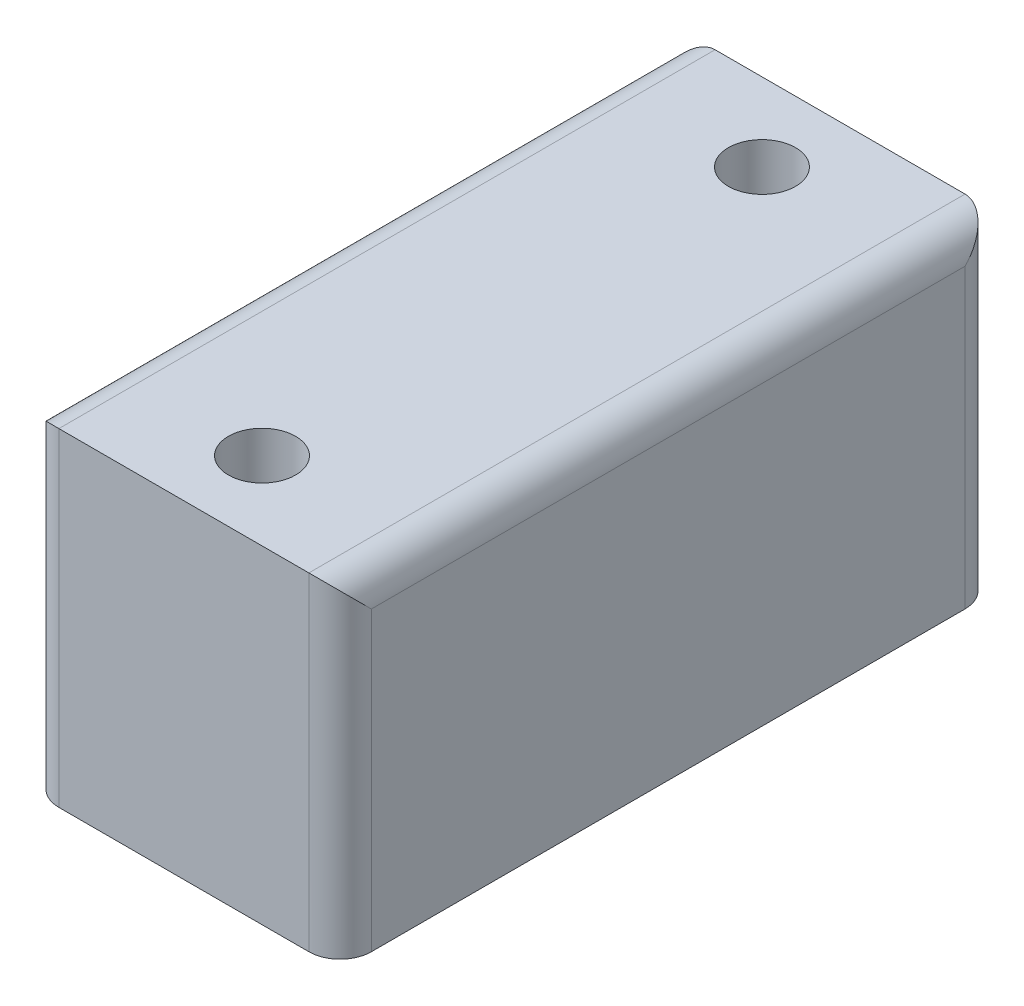
ISO-10303-21;
HEADER;
FILE_DESCRIPTION(('STEP AP214'),'2;1');
FILE_NAME('part.step','',(''),(''),'','','');
FILE_SCHEMA(('AUTOMOTIVE_DESIGN { 1 0 10303 214 1 1 1 1 }'));
ENDSEC;
DATA;
#1=APPLICATION_CONTEXT('core data for automotive mechanical design processes');
#2=APPLICATION_PROTOCOL_DEFINITION('international standard','automotive_design',2000,#1);
#3=PRODUCT_CONTEXT('',#1,'mechanical');
#4=PRODUCT('Part','Part','',(#3));
#5=PRODUCT_RELATED_PRODUCT_CATEGORY('part','',(#4));
#6=PRODUCT_DEFINITION_FORMATION('','',#4);
#7=PRODUCT_DEFINITION_CONTEXT('part definition',#1,'design');
#8=PRODUCT_DEFINITION('design','',#6,#7);
#9=PRODUCT_DEFINITION_SHAPE('','',#8);
#10=(LENGTH_UNIT() NAMED_UNIT(*) SI_UNIT(.MILLI.,.METRE.));
#11=(NAMED_UNIT(*) PLANE_ANGLE_UNIT() SI_UNIT($,.RADIAN.));
#12=(NAMED_UNIT(*) SI_UNIT($,.STERADIAN.) SOLID_ANGLE_UNIT());
#13=UNCERTAINTY_MEASURE_WITH_UNIT(LENGTH_MEASURE(1.E-05),#10,'distance_accuracy_value','');
#14=(GEOMETRIC_REPRESENTATION_CONTEXT(3) GLOBAL_UNCERTAINTY_ASSIGNED_CONTEXT((#13)) GLOBAL_UNIT_ASSIGNED_CONTEXT((#10,
#11,#12)) REPRESENTATION_CONTEXT('',''));
#15=CARTESIAN_POINT('',(0.,0.,0.));
#16=DIRECTION('',(0.,0.,1.));
#17=DIRECTION('',(1.,0.,0.));
#18=AXIS2_PLACEMENT_3D('',#15,#16,#17);
#19=CARTESIAN_POINT('',(0.,0.,42.));
#20=DIRECTION('',(-1.,0.,0.));
#21=DIRECTION('',(0.,0.,1.));
#22=AXIS2_PLACEMENT_3D('',#19,#20,#21);
#23=PLANE('',#22);
#24=DIRECTION('',(0.,0.,-1.));
#25=VECTOR('',#24,1.);
#26=CARTESIAN_POINT('',(0.,0.,42.));
#27=LINE('',#26,#25);
#28=CARTESIAN_POINT('',(0.,0.,40.));
#29=VERTEX_POINT('',#28);
#30=CARTESIAN_POINT('',(0.,0.,2.00000000000002));
#31=VERTEX_POINT('',#30);
#32=EDGE_CURVE('E128',#29,#31,#27,.T.);
#33=ORIENTED_EDGE('',*,*,#32,.T.);
#34=DIRECTION('',(0.,1.,0.));
#35=VECTOR('',#34,1.);
#36=CARTESIAN_POINT('',(0.,0.,2.));
#37=LINE('',#36,#35);
#38=CARTESIAN_POINT('',(0.,19.,2.));
#39=VERTEX_POINT('',#38);
#40=EDGE_CURVE('E150',#31,#39,#37,.T.);
#41=ORIENTED_EDGE('',*,*,#40,.T.);
#42=DIRECTION('',(0.,0.,-1.));
#43=VECTOR('',#42,1.);
#44=CARTESIAN_POINT('',(0.,19.,42.));
#45=LINE('',#44,#43);
#46=CARTESIAN_POINT('',(0.,19.,40.));
#47=VERTEX_POINT('',#46);
#48=EDGE_CURVE('E146',#39,#47,#45,.F.);
#49=ORIENTED_EDGE('',*,*,#48,.T.);
#50=DIRECTION('',(0.,1.,0.));
#51=VECTOR('',#50,1.);
#52=CARTESIAN_POINT('',(0.,0.,40.));
#53=LINE('',#52,#51);
#54=EDGE_CURVE('E148',#47,#29,#53,.F.);
#55=ORIENTED_EDGE('',*,*,#54,.T.);
#56=EDGE_LOOP('',(#33,#41,#49,#55));
#57=FACE_BOUND('',#56,.T.);
#58=ADVANCED_FACE('F41',(#57),#23,.F.);
#59=CARTESIAN_POINT('',(0.,21.,42.));
#60=DIRECTION('',(0.,-1.,0.));
#61=DIRECTION('',(1.,0.,0.));
#62=AXIS2_PLACEMENT_3D('',#59,#60,#61);
#63=PLANE('',#62);
#64=CARTESIAN_POINT('',(-10.,21.,5.));
#65=DIRECTION('',(0.,1.,0.));
#66=DIRECTION('',(-1.,0.,0.));
#67=AXIS2_PLACEMENT_3D('',#64,#65,#66);
#68=CIRCLE('',#67,2.15);
#69=CARTESIAN_POINT('',(-12.15,21.,5.));
#70=VERTEX_POINT('',#69);
#71=EDGE_CURVE('E193',#70,#70,#68,.T.);
#72=ORIENTED_EDGE('',*,*,#71,.F.);
#73=EDGE_LOOP('',(#72));
#74=FACE_BOUND('',#73,.T.);
#75=CARTESIAN_POINT('',(-10.,21.,37.));
#76=DIRECTION('',(0.,1.,0.));
#77=DIRECTION('',(1.,0.,0.));
#78=AXIS2_PLACEMENT_3D('',#75,#76,#77);
#79=CIRCLE('',#78,2.15);
#80=CARTESIAN_POINT('',(-7.85,21.,37.));
#81=VERTEX_POINT('',#80);
#82=EDGE_CURVE('E190',#81,#81,#79,.T.);
#83=ORIENTED_EDGE('',*,*,#82,.F.);
#84=EDGE_LOOP('',(#83));
#85=FACE_BOUND('',#84,.T.);
#86=DIRECTION('',(-1.,0.,0.));
#87=VECTOR('',#86,1.);
#88=CARTESIAN_POINT('',(0.,21.,42.));
#89=LINE('',#88,#87);
#90=CARTESIAN_POINT('',(-2.,21.,42.));
#91=VERTEX_POINT('',#90);
#92=CARTESIAN_POINT('',(-18.,21.,42.));
#93=VERTEX_POINT('',#92);
#94=EDGE_CURVE('E181',#91,#93,#89,.T.);
#95=ORIENTED_EDGE('',*,*,#94,.F.);
#96=DIRECTION('',(0.,0.,-1.));
#97=VECTOR('',#96,1.);
#98=CARTESIAN_POINT('',(-2.,21.,42.));
#99=LINE('',#98,#97);
#100=CARTESIAN_POINT('',(-2.,21.,0.));
#101=VERTEX_POINT('',#100);
#102=EDGE_CURVE('E11',#91,#101,#99,.T.);
#103=ORIENTED_EDGE('',*,*,#102,.T.);
#104=DIRECTION('',(-1.,0.,0.));
#105=VECTOR('',#104,1.);
#106=CARTESIAN_POINT('',(0.,21.,0.));
#107=LINE('',#106,#105);
#108=CARTESIAN_POINT('',(-18.,21.,0.));
#109=VERTEX_POINT('',#108);
#110=EDGE_CURVE('E186',#101,#109,#107,.T.);
#111=ORIENTED_EDGE('',*,*,#110,.T.);
#112=DIRECTION('',(0.,0.,-1.));
#113=VECTOR('',#112,1.);
#114=CARTESIAN_POINT('',(-18.,21.,42.));
#115=LINE('',#114,#113);
#116=EDGE_CURVE('E50',#109,#93,#115,.F.);
#117=ORIENTED_EDGE('',*,*,#116,.T.);
#118=EDGE_LOOP('',(#95,#103,#111,#117));
#119=FACE_BOUND('',#118,.T.);
#120=ADVANCED_FACE('F204',(#74,#85,#119),#63,.F.);
#121=CARTESIAN_POINT('',(-20.,0.,42.));
#122=DIRECTION('',(1.,0.,0.));
#123=DIRECTION('',(0.,1.,0.));
#124=AXIS2_PLACEMENT_3D('',#121,#122,#123);
#125=PLANE('',#124);
#126=DIRECTION('',(0.,0.,-1.));
#127=VECTOR('',#126,1.);
#128=CARTESIAN_POINT('',(-20.,19.,42.));
#129=LINE('',#128,#127);
#130=CARTESIAN_POINT('',(-20.,19.,40.));
#131=VERTEX_POINT('',#130);
#132=CARTESIAN_POINT('',(-20.,19.,2.));
#133=VERTEX_POINT('',#132);
#134=EDGE_CURVE('E127',#131,#133,#129,.T.);
#135=ORIENTED_EDGE('',*,*,#134,.T.);
#136=DIRECTION('',(0.,-1.,0.));
#137=VECTOR('',#136,1.);
#138=CARTESIAN_POINT('',(-20.,0.,2.));
#139=LINE('',#138,#137);
#140=CARTESIAN_POINT('',(-20.,0.,2.00000000000002));
#141=VERTEX_POINT('',#140);
#142=EDGE_CURVE('E126',#133,#141,#139,.T.);
#143=ORIENTED_EDGE('',*,*,#142,.T.);
#144=DIRECTION('',(0.,0.,-1.));
#145=VECTOR('',#144,1.);
#146=CARTESIAN_POINT('',(-20.,0.,42.));
#147=LINE('',#146,#145);
#148=CARTESIAN_POINT('',(-20.,0.,40.));
#149=VERTEX_POINT('',#148);
#150=EDGE_CURVE('E112',#149,#141,#147,.T.);
#151=ORIENTED_EDGE('',*,*,#150,.F.);
#152=DIRECTION('',(0.,-1.,0.));
#153=VECTOR('',#152,1.);
#154=CARTESIAN_POINT('',(-20.,21.,40.));
#155=LINE('',#154,#153);
#156=EDGE_CURVE('E123',#149,#131,#155,.F.);
#157=ORIENTED_EDGE('',*,*,#156,.T.);
#158=EDGE_LOOP('',(#135,#143,#151,#157));
#159=FACE_BOUND('',#158,.T.);
#160=ADVANCED_FACE('F122',(#159),#125,.F.);
#161=CARTESIAN_POINT('',(0.,0.,42.));
#162=DIRECTION('',(0.,1.,0.));
#163=DIRECTION('',(-1.,0.,0.));
#164=AXIS2_PLACEMENT_3D('',#161,#162,#163);
#165=PLANE('',#164);
#166=CARTESIAN_POINT('',(-9.99999999999999,0.,5.));
#167=DIRECTION('',(0.,1.,0.));
#168=DIRECTION('',(-1.,0.,0.));
#169=AXIS2_PLACEMENT_3D('',#166,#167,#168);
#170=CIRCLE('',#169,2.15);
#171=CARTESIAN_POINT('',(-12.15,0.,5.));
#172=VERTEX_POINT('',#171);
#173=EDGE_CURVE('E187',#172,#172,#170,.F.);
#174=ORIENTED_EDGE('',*,*,#173,.F.);
#175=EDGE_LOOP('',(#174));
#176=FACE_BOUND('',#175,.T.);
#177=CARTESIAN_POINT('',(-9.99999999999999,0.,37.));
#178=DIRECTION('',(0.,1.,0.));
#179=DIRECTION('',(-1.,0.,0.));
#180=AXIS2_PLACEMENT_3D('',#177,#178,#179);
#181=CIRCLE('',#180,2.15);
#182=CARTESIAN_POINT('',(-12.15,0.,37.));
#183=VERTEX_POINT('',#182);
#184=EDGE_CURVE('E160',#183,#183,#181,.F.);
#185=ORIENTED_EDGE('',*,*,#184,.F.);
#186=EDGE_LOOP('',(#185));
#187=FACE_BOUND('',#186,.T.);
#188=ORIENTED_EDGE('',*,*,#150,.T.);
#189=CARTESIAN_POINT('',(-18.,0.,2.));
#190=DIRECTION('',(0.,1.,0.));
#191=DIRECTION('',(-1.,0.,0.));
#192=AXIS2_PLACEMENT_3D('',#189,#190,#191);
#193=CIRCLE('',#192,2.);
#194=CARTESIAN_POINT('',(-18.,0.,0.));
#195=VERTEX_POINT('',#194);
#196=EDGE_CURVE('E140',#141,#195,#193,.F.);
#197=ORIENTED_EDGE('',*,*,#196,.T.);
#198=DIRECTION('',(1.,0.,0.));
#199=VECTOR('',#198,1.);
#200=CARTESIAN_POINT('',(0.,0.,0.));
#201=LINE('',#200,#199);
#202=CARTESIAN_POINT('',(-2.,0.,0.));
#203=VERTEX_POINT('',#202);
#204=EDGE_CURVE('E184',#195,#203,#201,.T.);
#205=ORIENTED_EDGE('',*,*,#204,.T.);
#206=CARTESIAN_POINT('',(-2.,0.,2.));
#207=DIRECTION('',(0.,1.,0.));
#208=DIRECTION('',(-1.,0.,0.));
#209=AXIS2_PLACEMENT_3D('',#206,#207,#208);
#210=CIRCLE('',#209,2.);
#211=EDGE_CURVE('E117',#203,#31,#210,.F.);
#212=ORIENTED_EDGE('',*,*,#211,.T.);
#213=ORIENTED_EDGE('',*,*,#32,.F.);
#214=CARTESIAN_POINT('',(-2.,0.,40.));
#215=DIRECTION('',(0.,1.,0.));
#216=DIRECTION('',(-1.,0.,0.));
#217=AXIS2_PLACEMENT_3D('',#214,#215,#216);
#218=CIRCLE('',#217,2.);
#219=CARTESIAN_POINT('',(-2.,0.,42.));
#220=VERTEX_POINT('',#219);
#221=EDGE_CURVE('E118',#29,#220,#218,.F.);
#222=ORIENTED_EDGE('',*,*,#221,.T.);
#223=DIRECTION('',(1.,0.,0.));
#224=VECTOR('',#223,1.);
#225=CARTESIAN_POINT('',(0.,0.,42.));
#226=LINE('',#225,#224);
#227=CARTESIAN_POINT('',(-18.,0.,42.));
#228=VERTEX_POINT('',#227);
#229=EDGE_CURVE('E113',#228,#220,#226,.T.);
#230=ORIENTED_EDGE('',*,*,#229,.F.);
#231=CARTESIAN_POINT('',(-18.,0.,40.));
#232=DIRECTION('',(0.,1.,0.));
#233=DIRECTION('',(-1.,0.,0.));
#234=AXIS2_PLACEMENT_3D('',#231,#232,#233);
#235=CIRCLE('',#234,2.);
#236=EDGE_CURVE('E109',#228,#149,#235,.F.);
#237=ORIENTED_EDGE('',*,*,#236,.T.);
#238=EDGE_LOOP('',(#188,#197,#205,#212,#213,#222,#230,#237));
#239=FACE_BOUND('',#238,.T.);
#240=ADVANCED_FACE('F111',(#176,#187,#239),#165,.F.);
#241=CARTESIAN_POINT('',(0.,0.,42.));
#242=DIRECTION('',(0.,0.,1.));
#243=DIRECTION('',(1.,0.,0.));
#244=AXIS2_PLACEMENT_3D('',#241,#242,#243);
#245=PLANE('',#244);
#246=ORIENTED_EDGE('',*,*,#94,.T.);
#247=DIRECTION('',(0.,-1.,0.));
#248=VECTOR('',#247,1.);
#249=CARTESIAN_POINT('',(-18.,0.,42.));
#250=LINE('',#249,#248);
#251=EDGE_CURVE('E154',#93,#228,#250,.T.);
#252=ORIENTED_EDGE('',*,*,#251,.T.);
#253=ORIENTED_EDGE('',*,*,#229,.T.);
#254=DIRECTION('',(0.,1.,0.));
#255=VECTOR('',#254,1.);
#256=CARTESIAN_POINT('',(-2.,21.,42.));
#257=LINE('',#256,#255);
#258=EDGE_CURVE('E64',#220,#91,#257,.T.);
#259=ORIENTED_EDGE('',*,*,#258,.T.);
#260=EDGE_LOOP('',(#246,#252,#253,#259));
#261=FACE_BOUND('',#260,.T.);
#262=ADVANCED_FACE('F210',(#261),#245,.T.);
#263=CARTESIAN_POINT('',(0.,0.,0.));
#264=DIRECTION('',(0.,0.,1.));
#265=DIRECTION('',(1.,0.,0.));
#266=AXIS2_PLACEMENT_3D('',#263,#264,#265);
#267=PLANE('',#266);
#268=ORIENTED_EDGE('',*,*,#204,.F.);
#269=DIRECTION('',(0.,-1.,0.));
#270=VECTOR('',#269,1.);
#271=CARTESIAN_POINT('',(-18.,0.,0.));
#272=LINE('',#271,#270);
#273=EDGE_CURVE('E144',#195,#109,#272,.F.);
#274=ORIENTED_EDGE('',*,*,#273,.T.);
#275=ORIENTED_EDGE('',*,*,#110,.F.);
#276=DIRECTION('',(0.,1.,0.));
#277=VECTOR('',#276,1.);
#278=CARTESIAN_POINT('',(-2.,0.,0.));
#279=LINE('',#278,#277);
#280=EDGE_CURVE('E142',#101,#203,#279,.F.);
#281=ORIENTED_EDGE('',*,*,#280,.T.);
#282=EDGE_LOOP('',(#268,#274,#275,#281));
#283=FACE_BOUND('',#282,.T.);
#284=ADVANCED_FACE('F219',(#283),#267,.F.);
#285=CARTESIAN_POINT('',(-9.99999999999999,-0.00100000000000447,37.));
#286=DIRECTION('',(0.,1.,0.));
#287=DIRECTION('',(-1.,0.,0.));
#288=AXIS2_PLACEMENT_3D('',#285,#286,#287);
#289=CYLINDRICAL_SURFACE('',#288,2.15);
#290=ORIENTED_EDGE('',*,*,#82,.T.);
#291=EDGE_LOOP('',(#290));
#292=FACE_BOUND('',#291,.T.);
#293=ORIENTED_EDGE('',*,*,#184,.T.);
#294=EDGE_LOOP('',(#293));
#295=FACE_BOUND('',#294,.T.);
#296=ADVANCED_FACE('F241',(#292,#295),#289,.F.);
#297=CARTESIAN_POINT('',(-9.99999999999999,-0.00100000000000447,5.));
#298=DIRECTION('',(0.,1.,0.));
#299=DIRECTION('',(-1.,0.,0.));
#300=AXIS2_PLACEMENT_3D('',#297,#298,#299);
#301=CYLINDRICAL_SURFACE('',#300,2.15);
#302=ORIENTED_EDGE('',*,*,#71,.T.);
#303=EDGE_LOOP('',(#302));
#304=FACE_BOUND('',#303,.T.);
#305=ORIENTED_EDGE('',*,*,#173,.T.);
#306=EDGE_LOOP('',(#305));
#307=FACE_BOUND('',#306,.T.);
#308=ADVANCED_FACE('F201',(#304,#307),#301,.F.);
#309=CARTESIAN_POINT('',(-18.,0.,40.));
#310=DIRECTION('',(0.,1.,0.));
#311=DIRECTION('',(-1.,0.,0.));
#312=AXIS2_PLACEMENT_3D('',#309,#310,#311);
#313=CYLINDRICAL_SURFACE('',#312,2.);
#314=ORIENTED_EDGE('',*,*,#236,.F.);
#315=ORIENTED_EDGE('',*,*,#251,.F.);
#316=CARTESIAN_POINT('',(-18.,19.,40.));
#317=DIRECTION('',(0.,0.707106781186547,-0.707106781186547));
#318=DIRECTION('',(0.,-0.707106781186547,-0.707106781186547));
#319=AXIS2_PLACEMENT_3D('',#316,#317,#318);
#320=ELLIPSE('',#319,2.82842712474619,2.);
#321=EDGE_CURVE('E132',#131,#93,#320,.T.);
#322=ORIENTED_EDGE('',*,*,#321,.F.);
#323=ORIENTED_EDGE('',*,*,#156,.F.);
#324=EDGE_LOOP('',(#314,#315,#322,#323));
#325=FACE_BOUND('',#324,.T.);
#326=ADVANCED_FACE('F130',(#325),#313,.T.);
#327=CARTESIAN_POINT('',(-18.,19.,42.));
#328=DIRECTION('',(0.,0.,-1.));
#329=DIRECTION('',(-1.,0.,0.));
#330=AXIS2_PLACEMENT_3D('',#327,#328,#329);
#331=CYLINDRICAL_SURFACE('',#330,2.);
#332=ORIENTED_EDGE('',*,*,#321,.T.);
#333=ORIENTED_EDGE('',*,*,#116,.F.);
#334=CARTESIAN_POINT('',(-18.,19.,2.));
#335=DIRECTION('',(0.,-0.707106781186547,-0.707106781186547));
#336=DIRECTION('',(0.,0.707106781186547,-0.707106781186547));
#337=AXIS2_PLACEMENT_3D('',#334,#335,#336);
#338=ELLIPSE('',#337,2.82842712474619,2.);
#339=EDGE_CURVE('E157',#133,#109,#338,.T.);
#340=ORIENTED_EDGE('',*,*,#339,.F.);
#341=ORIENTED_EDGE('',*,*,#134,.F.);
#342=EDGE_LOOP('',(#332,#333,#340,#341));
#343=FACE_BOUND('',#342,.T.);
#344=ADVANCED_FACE('F212',(#343),#331,.T.);
#345=CARTESIAN_POINT('',(-18.,0.,2.));
#346=DIRECTION('',(0.,-1.,0.));
#347=DIRECTION('',(1.,0.,0.));
#348=AXIS2_PLACEMENT_3D('',#345,#346,#347);
#349=CYLINDRICAL_SURFACE('',#348,2.);
#350=ORIENTED_EDGE('',*,*,#339,.T.);
#351=ORIENTED_EDGE('',*,*,#273,.F.);
#352=ORIENTED_EDGE('',*,*,#196,.F.);
#353=ORIENTED_EDGE('',*,*,#142,.F.);
#354=EDGE_LOOP('',(#350,#351,#352,#353));
#355=FACE_BOUND('',#354,.T.);
#356=ADVANCED_FACE('F216',(#355),#349,.T.);
#357=CARTESIAN_POINT('',(-2.,0.,40.));
#358=DIRECTION('',(0.,-1.,0.));
#359=DIRECTION('',(0.,0.,-1.));
#360=AXIS2_PLACEMENT_3D('',#357,#358,#359);
#361=CYLINDRICAL_SURFACE('',#360,2.);
#362=ORIENTED_EDGE('',*,*,#221,.F.);
#363=ORIENTED_EDGE('',*,*,#54,.F.);
#364=CARTESIAN_POINT('',(-2.,19.,40.));
#365=DIRECTION('',(0.,0.707106781186547,-0.707106781186547));
#366=DIRECTION('',(0.,-0.707106781186547,-0.707106781186547));
#367=AXIS2_PLACEMENT_3D('',#364,#365,#366);
#368=ELLIPSE('',#367,2.82842712474619,2.);
#369=EDGE_CURVE('E45',#91,#47,#368,.T.);
#370=ORIENTED_EDGE('',*,*,#369,.F.);
#371=ORIENTED_EDGE('',*,*,#258,.F.);
#372=EDGE_LOOP('',(#362,#363,#370,#371));
#373=FACE_BOUND('',#372,.T.);
#374=ADVANCED_FACE('F43',(#373),#361,.T.);
#375=CARTESIAN_POINT('',(-2.,19.,42.));
#376=DIRECTION('',(0.,0.,-1.));
#377=DIRECTION('',(-1.,0.,0.));
#378=AXIS2_PLACEMENT_3D('',#375,#376,#377);
#379=CYLINDRICAL_SURFACE('',#378,2.);
#380=ORIENTED_EDGE('',*,*,#369,.T.);
#381=ORIENTED_EDGE('',*,*,#48,.F.);
#382=CARTESIAN_POINT('',(-2.,19.,2.));
#383=DIRECTION('',(0.,-0.707106781186547,-0.707106781186547));
#384=DIRECTION('',(0.,0.707106781186547,-0.707106781186547));
#385=AXIS2_PLACEMENT_3D('',#382,#383,#384);
#386=ELLIPSE('',#385,2.82842712474619,2.);
#387=EDGE_CURVE('E161',#101,#39,#386,.T.);
#388=ORIENTED_EDGE('',*,*,#387,.F.);
#389=ORIENTED_EDGE('',*,*,#102,.F.);
#390=EDGE_LOOP('',(#380,#381,#388,#389));
#391=FACE_BOUND('',#390,.T.);
#392=ADVANCED_FACE('F171',(#391),#379,.T.);
#393=CARTESIAN_POINT('',(-2.,0.,2.));
#394=DIRECTION('',(0.,1.,0.));
#395=DIRECTION('',(0.,0.,1.));
#396=AXIS2_PLACEMENT_3D('',#393,#394,#395);
#397=CYLINDRICAL_SURFACE('',#396,2.);
#398=ORIENTED_EDGE('',*,*,#211,.F.);
#399=ORIENTED_EDGE('',*,*,#280,.F.);
#400=ORIENTED_EDGE('',*,*,#387,.T.);
#401=ORIENTED_EDGE('',*,*,#40,.F.);
#402=EDGE_LOOP('',(#398,#399,#400,#401));
#403=FACE_BOUND('',#402,.T.);
#404=ADVANCED_FACE('F220',(#403),#397,.T.);
#405=CLOSED_SHELL('',(#58,#120,#160,#240,#262,#284,#296,#308,#326,#344,#356,#374,#392,#404));
#406=MANIFOLD_SOLID_BREP('B2',#405);
#407=ADVANCED_BREP_SHAPE_REPRESENTATION('',(#18,#406),#14);
#408=SHAPE_DEFINITION_REPRESENTATION(#9,#407);
ENDSEC;
END-ISO-10303-21;
